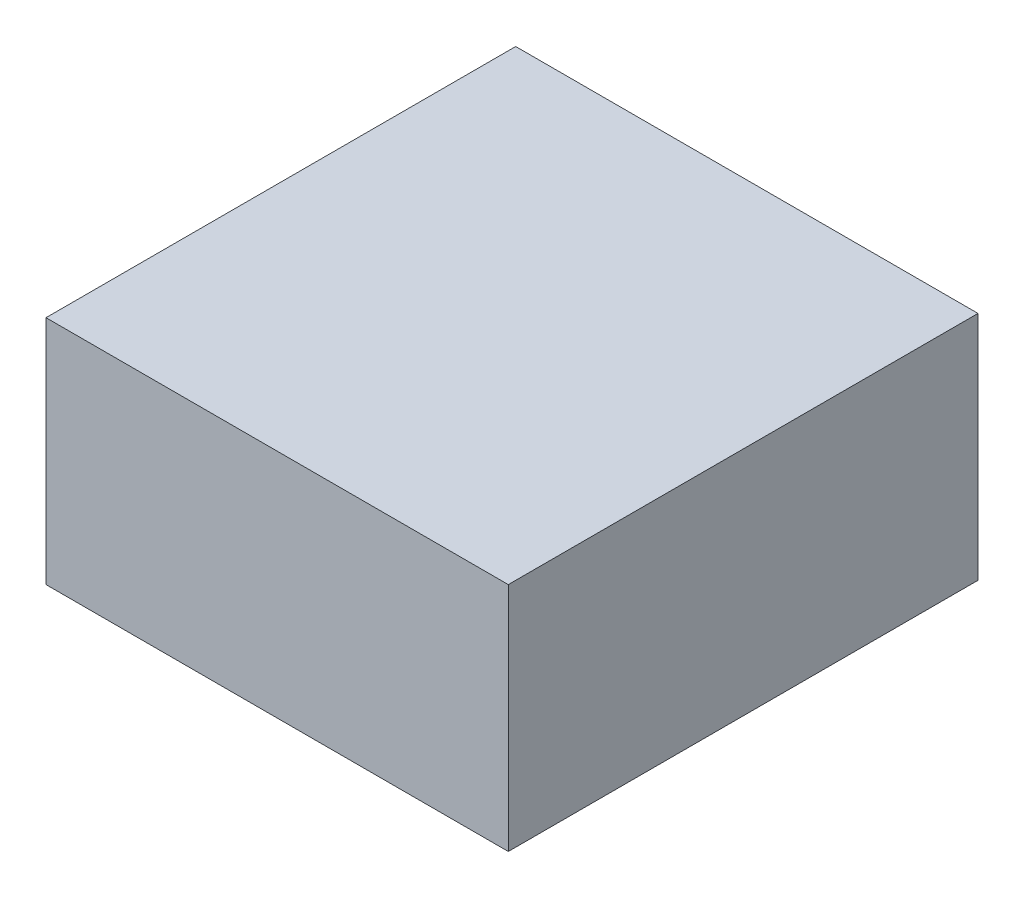
ISO-10303-21;
HEADER;
FILE_DESCRIPTION(('STEP AP214'),'2;1');
FILE_NAME('part.step','',(''),(''),'','','');
FILE_SCHEMA(('AUTOMOTIVE_DESIGN { 1 0 10303 214 1 1 1 1 }'));
ENDSEC;
DATA;
#1=APPLICATION_CONTEXT('core data for automotive mechanical design processes');
#2=APPLICATION_PROTOCOL_DEFINITION('international standard','automotive_design',2000,#1);
#3=PRODUCT_CONTEXT('',#1,'mechanical');
#4=PRODUCT('Part','Part','',(#3));
#5=PRODUCT_RELATED_PRODUCT_CATEGORY('part','',(#4));
#6=PRODUCT_DEFINITION_FORMATION('','',#4);
#7=PRODUCT_DEFINITION_CONTEXT('part definition',#1,'design');
#8=PRODUCT_DEFINITION('design','',#6,#7);
#9=PRODUCT_DEFINITION_SHAPE('','',#8);
#10=(LENGTH_UNIT() NAMED_UNIT(*) SI_UNIT(.MILLI.,.METRE.));
#11=(NAMED_UNIT(*) PLANE_ANGLE_UNIT() SI_UNIT($,.RADIAN.));
#12=(NAMED_UNIT(*) SI_UNIT($,.STERADIAN.) SOLID_ANGLE_UNIT());
#13=UNCERTAINTY_MEASURE_WITH_UNIT(LENGTH_MEASURE(1.E-05),#10,'distance_accuracy_value','');
#14=(GEOMETRIC_REPRESENTATION_CONTEXT(3) GLOBAL_UNCERTAINTY_ASSIGNED_CONTEXT((#13)) GLOBAL_UNIT_ASSIGNED_CONTEXT((#10,
#11,#12)) REPRESENTATION_CONTEXT('',''));
#15=CARTESIAN_POINT('',(0.,0.,0.));
#16=DIRECTION('',(0.,0.,1.));
#17=DIRECTION('',(1.,0.,0.));
#18=AXIS2_PLACEMENT_3D('',#15,#16,#17);
#19=CARTESIAN_POINT('',(0.,0.,1656.461));
#20=DIRECTION('',(0.,0.,1.));
#21=DIRECTION('',(1.,0.,0.));
#22=AXIS2_PLACEMENT_3D('',#19,#20,#21);
#23=PLANE('',#22);
#24=DIRECTION('',(1.,0.,0.));
#25=VECTOR('',#24,1.);
#26=CARTESIAN_POINT('',(-100.,230.,1656.461));
#27=LINE('',#26,#25);
#28=CARTESIAN_POINT('',(-100.,230.,1656.461));
#29=VERTEX_POINT('',#28);
#30=CARTESIAN_POINT('',(100.,230.,1656.461));
#31=VERTEX_POINT('',#30);
#32=EDGE_CURVE('E108',#29,#31,#27,.T.);
#33=ORIENTED_EDGE('',*,*,#32,.T.);
#34=DIRECTION('',(0.,1.,0.));
#35=VECTOR('',#34,1.);
#36=CARTESIAN_POINT('',(100.,230.,1656.461));
#37=LINE('',#36,#35);
#38=CARTESIAN_POINT('',(100.,330.,1656.461));
#39=VERTEX_POINT('',#38);
#40=EDGE_CURVE('E131',#31,#39,#37,.T.);
#41=ORIENTED_EDGE('',*,*,#40,.T.);
#42=DIRECTION('',(-1.,0.,0.));
#43=VECTOR('',#42,1.);
#44=CARTESIAN_POINT('',(100.,330.,1656.461));
#45=LINE('',#44,#43);
#46=CARTESIAN_POINT('',(-100.,330.,1656.461));
#47=VERTEX_POINT('',#46);
#48=EDGE_CURVE('E134',#39,#47,#45,.T.);
#49=ORIENTED_EDGE('',*,*,#48,.T.);
#50=DIRECTION('',(0.,-1.,0.));
#51=VECTOR('',#50,1.);
#52=CARTESIAN_POINT('',(-100.,330.,1656.461));
#53=LINE('',#52,#51);
#54=EDGE_CURVE('E113',#47,#29,#53,.T.);
#55=ORIENTED_EDGE('',*,*,#54,.T.);
#56=EDGE_LOOP('',(#33,#41,#49,#55));
#57=FACE_BOUND('',#56,.T.);
#58=ADVANCED_FACE('F62',(#57),#23,.T.);
#59=CARTESIAN_POINT('',(100.,230.,1453.26));
#60=DIRECTION('',(1.,0.,0.));
#61=DIRECTION('',(0.,0.,-1.));
#62=AXIS2_PLACEMENT_3D('',#59,#60,#61);
#63=PLANE('',#62);
#64=DIRECTION('',(0.,0.,1.));
#65=VECTOR('',#64,1.);
#66=CARTESIAN_POINT('',(100.,230.,1453.26));
#67=LINE('',#66,#65);
#68=CARTESIAN_POINT('',(100.,230.,1453.261));
#69=VERTEX_POINT('',#68);
#70=EDGE_CURVE('E66',#69,#31,#67,.T.);
#71=ORIENTED_EDGE('',*,*,#70,.F.);
#72=DIRECTION('',(0.,1.,0.));
#73=VECTOR('',#72,1.);
#74=CARTESIAN_POINT('',(100.,330.,1453.261));
#75=LINE('',#74,#73);
#76=CARTESIAN_POINT('',(100.,330.,1453.261));
#77=VERTEX_POINT('',#76);
#78=EDGE_CURVE('E109',#69,#77,#75,.T.);
#79=ORIENTED_EDGE('',*,*,#78,.T.);
#80=DIRECTION('',(0.,0.,1.));
#81=VECTOR('',#80,1.);
#82=CARTESIAN_POINT('',(100.,330.,1453.26));
#83=LINE('',#82,#81);
#84=EDGE_CURVE('E117',#77,#39,#83,.T.);
#85=ORIENTED_EDGE('',*,*,#84,.T.);
#86=ORIENTED_EDGE('',*,*,#40,.F.);
#87=EDGE_LOOP('',(#71,#79,#85,#86));
#88=FACE_BOUND('',#87,.T.);
#89=ADVANCED_FACE('F140',(#88),#63,.T.);
#90=CARTESIAN_POINT('',(100.,330.,1453.26));
#91=DIRECTION('',(0.,1.,0.));
#92=DIRECTION('',(0.,0.,1.));
#93=AXIS2_PLACEMENT_3D('',#90,#91,#92);
#94=PLANE('',#93);
#95=DIRECTION('',(1.,0.,0.));
#96=VECTOR('',#95,1.);
#97=CARTESIAN_POINT('',(-100.,330.,1453.261));
#98=LINE('',#97,#96);
#99=CARTESIAN_POINT('',(-100.,330.,1453.261));
#100=VERTEX_POINT('',#99);
#101=EDGE_CURVE('E79',#100,#77,#98,.T.);
#102=ORIENTED_EDGE('',*,*,#101,.F.);
#103=DIRECTION('',(0.,0.,1.));
#104=VECTOR('',#103,1.);
#105=CARTESIAN_POINT('',(-100.,330.,1453.26));
#106=LINE('',#105,#104);
#107=EDGE_CURVE('E71',#100,#47,#106,.T.);
#108=ORIENTED_EDGE('',*,*,#107,.T.);
#109=ORIENTED_EDGE('',*,*,#48,.F.);
#110=ORIENTED_EDGE('',*,*,#84,.F.);
#111=EDGE_LOOP('',(#102,#108,#109,#110));
#112=FACE_BOUND('',#111,.T.);
#113=ADVANCED_FACE('F119',(#112),#94,.T.);
#114=CARTESIAN_POINT('',(-100.,330.,1453.26));
#115=DIRECTION('',(-1.,0.,0.));
#116=DIRECTION('',(0.,0.,1.));
#117=AXIS2_PLACEMENT_3D('',#114,#115,#116);
#118=PLANE('',#117);
#119=ORIENTED_EDGE('',*,*,#107,.F.);
#120=DIRECTION('',(0.,1.,0.));
#121=VECTOR('',#120,1.);
#122=CARTESIAN_POINT('',(-100.,330.,1453.261));
#123=LINE('',#122,#121);
#124=CARTESIAN_POINT('',(-100.,230.,1453.261));
#125=VERTEX_POINT('',#124);
#126=EDGE_CURVE('E102',#125,#100,#123,.T.);
#127=ORIENTED_EDGE('',*,*,#126,.F.);
#128=DIRECTION('',(0.,0.,1.));
#129=VECTOR('',#128,1.);
#130=CARTESIAN_POINT('',(-100.,230.,1453.26));
#131=LINE('',#130,#129);
#132=EDGE_CURVE('E12',#125,#29,#131,.T.);
#133=ORIENTED_EDGE('',*,*,#132,.T.);
#134=ORIENTED_EDGE('',*,*,#54,.F.);
#135=EDGE_LOOP('',(#119,#127,#133,#134));
#136=FACE_BOUND('',#135,.T.);
#137=ADVANCED_FACE('F111',(#136),#118,.T.);
#138=CARTESIAN_POINT('',(-100.,230.,1453.26));
#139=DIRECTION('',(0.,-1.,0.));
#140=DIRECTION('',(0.,0.,-1.));
#141=AXIS2_PLACEMENT_3D('',#138,#139,#140);
#142=PLANE('',#141);
#143=ORIENTED_EDGE('',*,*,#132,.F.);
#144=DIRECTION('',(1.,0.,0.));
#145=VECTOR('',#144,1.);
#146=CARTESIAN_POINT('',(-100.,230.,1453.261));
#147=LINE('',#146,#145);
#148=EDGE_CURVE('E106',#125,#69,#147,.T.);
#149=ORIENTED_EDGE('',*,*,#148,.T.);
#150=ORIENTED_EDGE('',*,*,#70,.T.);
#151=ORIENTED_EDGE('',*,*,#32,.F.);
#152=EDGE_LOOP('',(#143,#149,#150,#151));
#153=FACE_BOUND('',#152,.T.);
#154=ADVANCED_FACE('F64',(#153),#142,.T.);
#155=CARTESIAN_POINT('',(-100.,330.,1453.261));
#156=DIRECTION('',(0.,0.,-1.));
#157=DIRECTION('',(-1.,0.,0.));
#158=AXIS2_PLACEMENT_3D('',#155,#156,#157);
#159=PLANE('',#158);
#160=ORIENTED_EDGE('',*,*,#78,.F.);
#161=ORIENTED_EDGE('',*,*,#148,.F.);
#162=ORIENTED_EDGE('',*,*,#126,.T.);
#163=ORIENTED_EDGE('',*,*,#101,.T.);
#164=EDGE_LOOP('',(#160,#161,#162,#163));
#165=FACE_BOUND('',#164,.T.);
#166=ADVANCED_FACE('F104',(#165),#159,.T.);
#167=CLOSED_SHELL('',(#58,#89,#113,#137,#154,#166));
#168=MANIFOLD_SOLID_BREP('B2',#167);
#169=ADVANCED_BREP_SHAPE_REPRESENTATION('',(#18,#168),#14);
#170=SHAPE_DEFINITION_REPRESENTATION(#9,#169);
ENDSEC;
END-ISO-10303-21;
